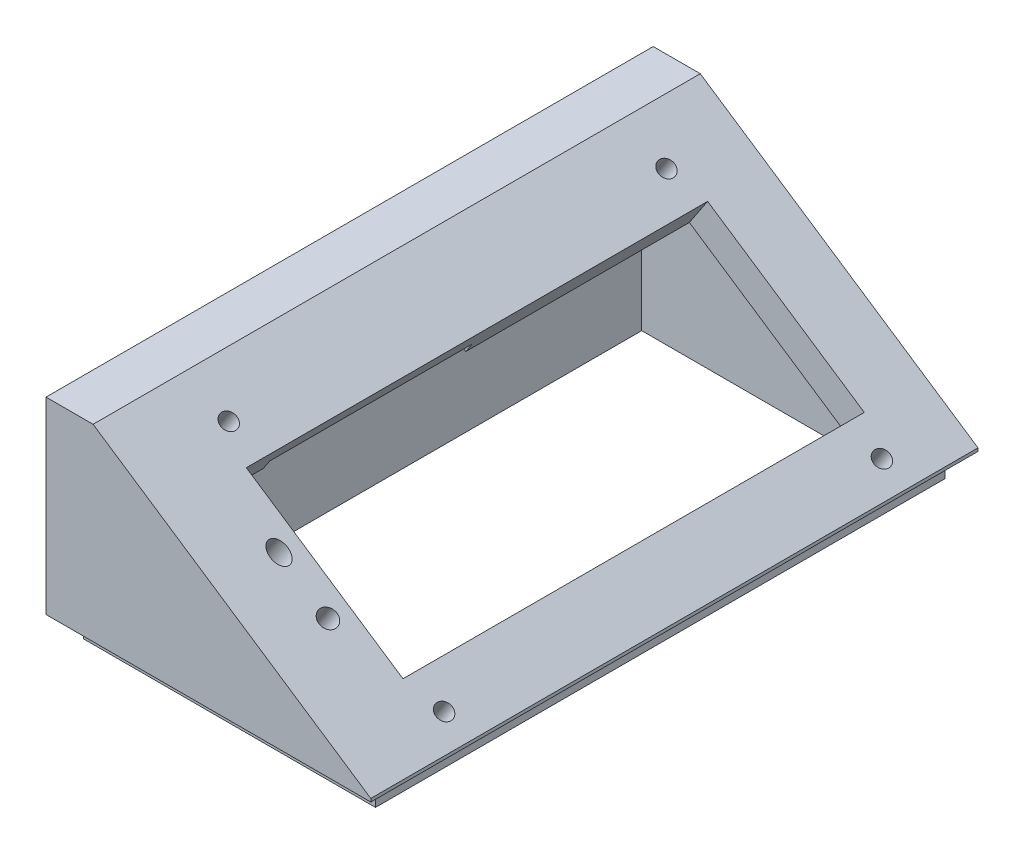
ISO-10303-21;
HEADER;
FILE_DESCRIPTION(('STEP AP214'),'2;1');
FILE_NAME('part.step','',(''),(''),'','','');
FILE_SCHEMA(('AUTOMOTIVE_DESIGN { 1 0 10303 214 1 1 1 1 }'));
ENDSEC;
DATA;
#1=APPLICATION_CONTEXT('core data for automotive mechanical design processes');
#2=APPLICATION_PROTOCOL_DEFINITION('international standard','automotive_design',2000,#1);
#3=PRODUCT_CONTEXT('',#1,'mechanical');
#4=PRODUCT('Part','Part','',(#3));
#5=PRODUCT_RELATED_PRODUCT_CATEGORY('part','',(#4));
#6=PRODUCT_DEFINITION_FORMATION('','',#4);
#7=PRODUCT_DEFINITION_CONTEXT('part definition',#1,'design');
#8=PRODUCT_DEFINITION('design','',#6,#7);
#9=PRODUCT_DEFINITION_SHAPE('','',#8);
#10=(LENGTH_UNIT() NAMED_UNIT(*) SI_UNIT(.MILLI.,.METRE.));
#11=(NAMED_UNIT(*) PLANE_ANGLE_UNIT() SI_UNIT($,.RADIAN.));
#12=(NAMED_UNIT(*) SI_UNIT($,.STERADIAN.) SOLID_ANGLE_UNIT());
#13=UNCERTAINTY_MEASURE_WITH_UNIT(LENGTH_MEASURE(1.E-05),#10,'distance_accuracy_value','');
#14=(GEOMETRIC_REPRESENTATION_CONTEXT(3) GLOBAL_UNCERTAINTY_ASSIGNED_CONTEXT((#13)) GLOBAL_UNIT_ASSIGNED_CONTEXT((#10,
#11,#12)) REPRESENTATION_CONTEXT('',''));
#15=CARTESIAN_POINT('',(0.,0.,0.));
#16=DIRECTION('',(0.,0.,1.));
#17=DIRECTION('',(1.,0.,0.));
#18=AXIS2_PLACEMENT_3D('',#15,#16,#17);
#19=CARTESIAN_POINT('',(0.,0.,64.5));
#20=DIRECTION('',(0.,1.,0.));
#21=DIRECTION('',(0.,0.,1.));
#22=AXIS2_PLACEMENT_3D('',#19,#20,#21);
#23=PLANE('',#22);
#24=DIRECTION('',(1.,0.,0.));
#25=VECTOR('',#24,1.);
#26=CARTESIAN_POINT('',(0.,0.,-64.5));
#27=LINE('',#26,#25);
#28=CARTESIAN_POINT('',(0.,0.,-64.5));
#29=VERTEX_POINT('',#28);
#30=CARTESIAN_POINT('',(69.,0.,-64.5));
#31=VERTEX_POINT('',#30);
#32=EDGE_CURVE('E239',#29,#31,#27,.T.);
#33=ORIENTED_EDGE('',*,*,#32,.T.);
#34=DIRECTION('',(0.,0.,1.));
#35=VECTOR('',#34,1.);
#36=CARTESIAN_POINT('',(69.,0.,64.5));
#37=LINE('',#36,#35);
#38=CARTESIAN_POINT('',(69.,0.,64.5));
#39=VERTEX_POINT('',#38);
#40=EDGE_CURVE('E51',#31,#39,#37,.T.);
#41=ORIENTED_EDGE('',*,*,#40,.T.);
#42=DIRECTION('',(1.,0.,0.));
#43=VECTOR('',#42,1.);
#44=CARTESIAN_POINT('',(0.,0.,64.5));
#45=LINE('',#44,#43);
#46=CARTESIAN_POINT('',(0.,0.,64.5));
#47=VERTEX_POINT('',#46);
#48=EDGE_CURVE('E222',#47,#39,#45,.T.);
#49=ORIENTED_EDGE('',*,*,#48,.F.);
#50=DIRECTION('',(0.,0.,-1.));
#51=VECTOR('',#50,1.);
#52=CARTESIAN_POINT('',(0.,0.,64.5));
#53=LINE('',#52,#51);
#54=EDGE_CURVE('E250',#47,#29,#53,.T.);
#55=ORIENTED_EDGE('',*,*,#54,.T.);
#56=EDGE_LOOP('',(#33,#41,#49,#55));
#57=FACE_BOUND('',#56,.T.);
#58=DIRECTION('',(0.,0.,-1.));
#59=VECTOR('',#58,1.);
#60=CARTESIAN_POINT('',(3.99999999999996,0.,60.5));
#61=LINE('',#60,#59);
#62=CARTESIAN_POINT('',(3.99999999999996,0.,60.5));
#63=VERTEX_POINT('',#62);
#64=CARTESIAN_POINT('',(3.99999999999996,0.,-60.5));
#65=VERTEX_POINT('',#64);
#66=EDGE_CURVE('E411',#63,#65,#61,.T.);
#67=ORIENTED_EDGE('',*,*,#66,.F.);
#68=DIRECTION('',(-1.,0.,0.));
#69=VECTOR('',#68,1.);
#70=CARTESIAN_POINT('',(3.99999999999996,0.,60.5));
#71=LINE('',#70,#69);
#72=CARTESIAN_POINT('',(66.,0.,60.5));
#73=VERTEX_POINT('',#72);
#74=EDGE_CURVE('E413',#73,#63,#71,.T.);
#75=ORIENTED_EDGE('',*,*,#74,.F.);
#76=DIRECTION('',(0.,0.,1.));
#77=VECTOR('',#76,1.);
#78=CARTESIAN_POINT('',(66.,0.,60.5));
#79=LINE('',#78,#77);
#80=CARTESIAN_POINT('',(66.,0.,-60.5));
#81=VERTEX_POINT('',#80);
#82=EDGE_CURVE('E430',#81,#73,#79,.T.);
#83=ORIENTED_EDGE('',*,*,#82,.F.);
#84=DIRECTION('',(1.,0.,0.));
#85=VECTOR('',#84,1.);
#86=CARTESIAN_POINT('',(3.99999999999996,0.,-60.5));
#87=LINE('',#86,#85);
#88=EDGE_CURVE('E416',#65,#81,#87,.T.);
#89=ORIENTED_EDGE('',*,*,#88,.F.);
#90=EDGE_LOOP('',(#67,#75,#83,#89));
#91=FACE_BOUND('',#90,.T.);
#92=ADVANCED_FACE('F37',(#57,#91),#23,.F.);
#93=CARTESIAN_POINT('',(0.,0.,64.5));
#94=DIRECTION('',(1.,0.,0.));
#95=DIRECTION('',(0.,0.,-1.));
#96=AXIS2_PLACEMENT_3D('',#93,#94,#95);
#97=PLANE('',#96);
#98=DIRECTION('',(0.,0.,1.));
#99=VECTOR('',#98,1.);
#100=CARTESIAN_POINT('',(0.,3.,35.5));
#101=LINE('',#100,#99);
#102=CARTESIAN_POINT('',(0.,3.,35.5));
#103=VERTEX_POINT('',#102);
#104=CARTESIAN_POINT('',(0.,3.,55.5));
#105=VERTEX_POINT('',#104);
#106=EDGE_CURVE('E479',#103,#105,#101,.T.);
#107=ORIENTED_EDGE('',*,*,#106,.F.);
#108=DIRECTION('',(0.,-1.,0.));
#109=VECTOR('',#108,1.);
#110=CARTESIAN_POINT('',(0.,3.,35.5));
#111=LINE('',#110,#109);
#112=CARTESIAN_POINT('',(0.,16.,35.5));
#113=VERTEX_POINT('',#112);
#114=EDGE_CURVE('E472',#113,#103,#111,.T.);
#115=ORIENTED_EDGE('',*,*,#114,.F.);
#116=DIRECTION('',(0.,0.,-1.));
#117=VECTOR('',#116,1.);
#118=CARTESIAN_POINT('',(0.,16.,35.5));
#119=LINE('',#118,#117);
#120=CARTESIAN_POINT('',(0.,16.,55.5));
#121=VERTEX_POINT('',#120);
#122=EDGE_CURVE('E291',#121,#113,#119,.T.);
#123=ORIENTED_EDGE('',*,*,#122,.F.);
#124=DIRECTION('',(0.,1.,0.));
#125=VECTOR('',#124,1.);
#126=CARTESIAN_POINT('',(0.,3.,55.5));
#127=LINE('',#126,#125);
#128=EDGE_CURVE('E279',#105,#121,#127,.T.);
#129=ORIENTED_EDGE('',*,*,#128,.F.);
#130=EDGE_LOOP('',(#107,#115,#123,#129));
#131=FACE_BOUND('',#130,.T.);
#132=DIRECTION('',(0.,-1.,0.));
#133=VECTOR('',#132,1.);
#134=CARTESIAN_POINT('',(0.,0.,-64.5));
#135=LINE('',#134,#133);
#136=CARTESIAN_POINT('',(0.,40.,-64.5));
#137=VERTEX_POINT('',#136);
#138=EDGE_CURVE('E236',#137,#29,#135,.T.);
#139=ORIENTED_EDGE('',*,*,#138,.T.);
#140=ORIENTED_EDGE('',*,*,#54,.F.);
#141=DIRECTION('',(0.,-1.,0.));
#142=VECTOR('',#141,1.);
#143=CARTESIAN_POINT('',(0.,0.,64.5));
#144=LINE('',#143,#142);
#145=CARTESIAN_POINT('',(0.,40.,64.5));
#146=VERTEX_POINT('',#145);
#147=EDGE_CURVE('E232',#146,#47,#144,.T.);
#148=ORIENTED_EDGE('',*,*,#147,.F.);
#149=DIRECTION('',(0.,0.,-1.));
#150=VECTOR('',#149,1.);
#151=CARTESIAN_POINT('',(0.,40.,64.5));
#152=LINE('',#151,#150);
#153=EDGE_CURVE('E230',#146,#137,#152,.T.);
#154=ORIENTED_EDGE('',*,*,#153,.T.);
#155=EDGE_LOOP('',(#139,#140,#148,#154));
#156=FACE_BOUND('',#155,.T.);
#157=ADVANCED_FACE('F39',(#131,#156),#97,.F.);
#158=CARTESIAN_POINT('',(10.,40.,64.5));
#159=DIRECTION('',(-0.554700196225229,-0.832050294337844,0.));
#160=DIRECTION('',(0.832050294337844,-0.554700196225229,0.));
#161=AXIS2_PLACEMENT_3D('',#158,#159,#160);
#162=PLANE('',#161);
#163=CARTESIAN_POINT('',(18.3205029433784,34.4529980377477,44.));
#164=DIRECTION('',(0.554700196225229,0.832050294337844,0.));
#165=DIRECTION('',(-0.832050294337844,0.554700196225229,0.));
#166=AXIS2_PLACEMENT_3D('',#163,#164,#165);
#167=CIRCLE('',#166,1.74999999999999);
#168=CARTESIAN_POINT('',(16.8644149282872,35.4237233811419,44.));
#169=VERTEX_POINT('',#168);
#170=EDGE_CURVE('E283',#169,#169,#167,.T.);
#171=ORIENTED_EDGE('',*,*,#170,.F.);
#172=EDGE_LOOP('',(#171));
#173=FACE_BOUND('',#172,.T.);
#174=CARTESIAN_POINT('',(18.3205029433785,34.4529980377477,-49.));
#175=DIRECTION('',(0.554700196225229,0.832050294337844,0.));
#176=DIRECTION('',(-0.832050294337844,0.554700196225229,0.));
#177=AXIS2_PLACEMENT_3D('',#174,#175,#176);
#178=CIRCLE('',#177,1.74999999999999);
#179=CARTESIAN_POINT('',(16.8644149282872,35.4237233811419,-49.));
#180=VERTEX_POINT('',#179);
#181=EDGE_CURVE('E297',#180,#180,#178,.T.);
#182=ORIENTED_EDGE('',*,*,#181,.F.);
#183=EDGE_LOOP('',(#182));
#184=FACE_BOUND('',#183,.T.);
#185=CARTESIAN_POINT('',(64.0832691319599,3.9444872453601,-49.));
#186=DIRECTION('',(0.554700196225229,0.832050294337844,0.));
#187=DIRECTION('',(-0.832050294337844,0.554700196225229,0.));
#188=AXIS2_PLACEMENT_3D('',#185,#186,#187);
#189=CIRCLE('',#188,1.74999999999999);
#190=CARTESIAN_POINT('',(62.6271811168687,4.91521258875424,-49.));
#191=VERTEX_POINT('',#190);
#192=EDGE_CURVE('E303',#191,#191,#189,.T.);
#193=ORIENTED_EDGE('',*,*,#192,.F.);
#194=EDGE_LOOP('',(#193));
#195=FACE_BOUND('',#194,.T.);
#196=CARTESIAN_POINT('',(64.0832691319599,3.94448724536011,44.));
#197=DIRECTION('',(0.554700196225229,0.832050294337844,0.));
#198=DIRECTION('',(-0.832050294337844,0.554700196225229,0.));
#199=AXIS2_PLACEMENT_3D('',#196,#197,#198);
#200=CIRCLE('',#199,1.74999999999999);
#201=CARTESIAN_POINT('',(62.6271811168686,4.91521258875425,44.));
#202=VERTEX_POINT('',#201);
#203=EDGE_CURVE('E309',#202,#202,#200,.T.);
#204=ORIENTED_EDGE('',*,*,#203,.F.);
#205=EDGE_LOOP('',(#204));
#206=FACE_BOUND('',#205,.T.);
#207=CARTESIAN_POINT('',(46.4022003772807,15.7318664151462,51.));
#208=DIRECTION('',(0.554700196225229,0.832050294337844,0.));
#209=DIRECTION('',(-0.832050294337844,0.554700196225229,0.));
#210=AXIS2_PLACEMENT_3D('',#207,#208,#209);
#211=CIRCLE('',#210,1.925);
#212=CARTESIAN_POINT('',(44.8005035606803,16.7996642928798,51.));
#213=VERTEX_POINT('',#212);
#214=EDGE_CURVE('E316',#213,#213,#211,.T.);
#215=ORIENTED_EDGE('',*,*,#214,.F.);
#216=EDGE_LOOP('',(#215));
#217=FACE_BOUND('',#216,.T.);
#218=CARTESIAN_POINT('',(36.0015716980576,22.6656188679616,51.));
#219=DIRECTION('',(0.554700196225229,0.832050294337844,0.));
#220=DIRECTION('',(-0.832050294337844,0.554700196225229,0.));
#221=AXIS2_PLACEMENT_3D('',#218,#219,#220);
#222=ELLIPSE('',#221,2.50000000000001,1.85);
#223=CARTESIAN_POINT('',(33.921445962213,24.0523693585247,51.));
#224=VERTEX_POINT('',#223);
#225=EDGE_CURVE('E315',#224,#224,#222,.T.);
#226=ORIENTED_EDGE('',*,*,#225,.F.);
#227=EDGE_LOOP('',(#226));
#228=FACE_BOUND('',#227,.T.);
#229=DIRECTION('',(0.832050294337844,-0.554700196225229,0.));
#230=VECTOR('',#229,1.);
#231=CARTESIAN_POINT('',(24.5608801509123,30.2927465660585,46.5));
#232=LINE('',#231,#230);
#233=CARTESIAN_POINT('',(24.5608801509123,30.2927465660585,46.5));
#234=VERTEX_POINT('',#233);
#235=CARTESIAN_POINT('',(57.842891924426,8.10473871704932,46.5));
#236=VERTEX_POINT('',#235);
#237=EDGE_CURVE('E540',#234,#236,#232,.T.);
#238=ORIENTED_EDGE('',*,*,#237,.F.);
#239=DIRECTION('',(0.,0.,1.));
#240=VECTOR('',#239,1.);
#241=CARTESIAN_POINT('',(24.5608801509123,30.2927465660585,46.5));
#242=LINE('',#241,#240);
#243=CARTESIAN_POINT('',(24.5608801509123,30.2927465660585,-51.5));
#244=VERTEX_POINT('',#243);
#245=EDGE_CURVE('E525',#244,#234,#242,.T.);
#246=ORIENTED_EDGE('',*,*,#245,.F.);
#247=DIRECTION('',(-0.832050294337844,0.554700196225229,0.));
#248=VECTOR('',#247,1.);
#249=CARTESIAN_POINT('',(24.5608801509123,30.2927465660585,-51.5));
#250=LINE('',#249,#248);
#251=CARTESIAN_POINT('',(57.842891924426,8.10473871704932,-51.5));
#252=VERTEX_POINT('',#251);
#253=EDGE_CURVE('E546',#252,#244,#250,.T.);
#254=ORIENTED_EDGE('',*,*,#253,.F.);
#255=DIRECTION('',(0.,0.,-1.));
#256=VECTOR('',#255,1.);
#257=CARTESIAN_POINT('',(57.842891924426,8.10473871704932,46.5));
#258=LINE('',#257,#256);
#259=EDGE_CURVE('E543',#236,#252,#258,.T.);
#260=ORIENTED_EDGE('',*,*,#259,.F.);
#261=EDGE_LOOP('',(#238,#246,#254,#260));
#262=FACE_BOUND('',#261,.T.);
#263=DIRECTION('',(-0.832050294337844,0.554700196225229,0.));
#264=VECTOR('',#263,1.);
#265=CARTESIAN_POINT('',(10.,40.,64.5));
#266=LINE('',#265,#264);
#267=CARTESIAN_POINT('',(69.,0.66666666666667,64.5));
#268=VERTEX_POINT('',#267);
#269=CARTESIAN_POINT('',(10.,40.,64.5));
#270=VERTEX_POINT('',#269);
#271=EDGE_CURVE('E219',#268,#270,#266,.T.);
#272=ORIENTED_EDGE('',*,*,#271,.F.);
#273=DIRECTION('',(0.,0.,-1.));
#274=VECTOR('',#273,1.);
#275=CARTESIAN_POINT('',(69.,0.666666666666663,64.5));
#276=LINE('',#275,#274);
#277=CARTESIAN_POINT('',(69.,0.66666666666667,-64.5));
#278=VERTEX_POINT('',#277);
#279=EDGE_CURVE('E208',#268,#278,#276,.T.);
#280=ORIENTED_EDGE('',*,*,#279,.T.);
#281=DIRECTION('',(-0.832050294337844,0.554700196225229,0.));
#282=VECTOR('',#281,1.);
#283=CARTESIAN_POINT('',(10.,40.,-64.5));
#284=LINE('',#283,#282);
#285=CARTESIAN_POINT('',(10.,40.,-64.5));
#286=VERTEX_POINT('',#285);
#287=EDGE_CURVE('E243',#278,#286,#284,.T.);
#288=ORIENTED_EDGE('',*,*,#287,.T.);
#289=DIRECTION('',(0.,0.,-1.));
#290=VECTOR('',#289,1.);
#291=CARTESIAN_POINT('',(10.,40.,64.5));
#292=LINE('',#291,#290);
#293=EDGE_CURVE('E226',#270,#286,#292,.T.);
#294=ORIENTED_EDGE('',*,*,#293,.F.);
#295=EDGE_LOOP('',(#272,#280,#288,#294));
#296=FACE_BOUND('',#295,.T.);
#297=ADVANCED_FACE('F224',(#173,#184,#195,#206,#217,#228,#262,#296),#162,.F.);
#298=CARTESIAN_POINT('',(0.,40.,64.5));
#299=DIRECTION('',(0.,-1.,0.));
#300=DIRECTION('',(0.,0.,-1.));
#301=AXIS2_PLACEMENT_3D('',#298,#299,#300);
#302=PLANE('',#301);
#303=DIRECTION('',(-1.,0.,0.));
#304=VECTOR('',#303,1.);
#305=CARTESIAN_POINT('',(0.,40.,-64.5));
#306=LINE('',#305,#304);
#307=EDGE_CURVE('E245',#286,#137,#306,.T.);
#308=ORIENTED_EDGE('',*,*,#307,.T.);
#309=ORIENTED_EDGE('',*,*,#153,.F.);
#310=DIRECTION('',(-1.,0.,0.));
#311=VECTOR('',#310,1.);
#312=CARTESIAN_POINT('',(0.,40.,64.5));
#313=LINE('',#312,#311);
#314=EDGE_CURVE('E228',#270,#146,#313,.T.);
#315=ORIENTED_EDGE('',*,*,#314,.F.);
#316=ORIENTED_EDGE('',*,*,#293,.T.);
#317=EDGE_LOOP('',(#308,#309,#315,#316));
#318=FACE_BOUND('',#317,.T.);
#319=ADVANCED_FACE('F394',(#318),#302,.F.);
#320=CARTESIAN_POINT('',(0.,0.,64.5));
#321=DIRECTION('',(0.,0.,-1.));
#322=DIRECTION('',(-1.,0.,0.));
#323=AXIS2_PLACEMENT_3D('',#320,#321,#322);
#324=PLANE('',#323);
#325=ORIENTED_EDGE('',*,*,#48,.T.);
#326=DIRECTION('',(0.,-1.,0.));
#327=VECTOR('',#326,1.);
#328=CARTESIAN_POINT('',(69.,-4.05126940790807,64.5));
#329=LINE('',#328,#327);
#330=EDGE_CURVE('E211',#268,#39,#329,.T.);
#331=ORIENTED_EDGE('',*,*,#330,.F.);
#332=ORIENTED_EDGE('',*,*,#271,.T.);
#333=ORIENTED_EDGE('',*,*,#314,.T.);
#334=ORIENTED_EDGE('',*,*,#147,.T.);
#335=EDGE_LOOP('',(#325,#331,#332,#333,#334));
#336=FACE_BOUND('',#335,.T.);
#337=ADVANCED_FACE('F218',(#336),#324,.F.);
#338=CARTESIAN_POINT('',(0.,0.,-64.5));
#339=DIRECTION('',(0.,0.,-1.));
#340=DIRECTION('',(-1.,0.,0.));
#341=AXIS2_PLACEMENT_3D('',#338,#339,#340);
#342=PLANE('',#341);
#343=DIRECTION('',(0.,1.,0.));
#344=VECTOR('',#343,1.);
#345=CARTESIAN_POINT('',(69.,0.,-64.5));
#346=LINE('',#345,#344);
#347=EDGE_CURVE('E11',#31,#278,#346,.T.);
#348=ORIENTED_EDGE('',*,*,#347,.F.);
#349=ORIENTED_EDGE('',*,*,#32,.F.);
#350=ORIENTED_EDGE('',*,*,#138,.F.);
#351=ORIENTED_EDGE('',*,*,#307,.F.);
#352=ORIENTED_EDGE('',*,*,#287,.F.);
#353=EDGE_LOOP('',(#348,#349,#350,#351,#352));
#354=FACE_BOUND('',#353,.T.);
#355=ADVANCED_FACE('F390',(#354),#342,.T.);
#356=CARTESIAN_POINT('',(3.99999999999996,-4.5,60.5));
#357=DIRECTION('',(1.,0.,0.));
#358=DIRECTION('',(0.,0.,-1.));
#359=AXIS2_PLACEMENT_3D('',#356,#357,#358);
#360=PLANE('',#359);
#361=ORIENTED_EDGE('',*,*,#66,.T.);
#362=DIRECTION('',(0.,1.,0.));
#363=VECTOR('',#362,1.);
#364=CARTESIAN_POINT('',(3.99999999999996,-4.5,-60.5));
#365=LINE('',#364,#363);
#366=CARTESIAN_POINT('',(3.99999999999996,-4.5,-60.5));
#367=VERTEX_POINT('',#366);
#368=EDGE_CURVE('E240',#367,#65,#365,.T.);
#369=ORIENTED_EDGE('',*,*,#368,.F.);
#370=DIRECTION('',(0.,0.,-1.));
#371=VECTOR('',#370,1.);
#372=CARTESIAN_POINT('',(3.99999999999996,-4.5,60.5));
#373=LINE('',#372,#371);
#374=CARTESIAN_POINT('',(3.99999999999996,-4.5,60.5));
#375=VERTEX_POINT('',#374);
#376=EDGE_CURVE('E429',#375,#367,#373,.T.);
#377=ORIENTED_EDGE('',*,*,#376,.F.);
#378=DIRECTION('',(0.,1.,0.));
#379=VECTOR('',#378,1.);
#380=CARTESIAN_POINT('',(3.99999999999996,-4.5,60.5));
#381=LINE('',#380,#379);
#382=EDGE_CURVE('E425',#375,#63,#381,.T.);
#383=ORIENTED_EDGE('',*,*,#382,.T.);
#384=EDGE_LOOP('',(#361,#369,#377,#383));
#385=FACE_BOUND('',#384,.T.);
#386=ADVANCED_FACE('F386',(#385),#360,.F.);
#387=CARTESIAN_POINT('',(3.99999999999996,-4.5,-60.5));
#388=DIRECTION('',(0.,0.,1.));
#389=DIRECTION('',(1.,0.,0.));
#390=AXIS2_PLACEMENT_3D('',#387,#388,#389);
#391=PLANE('',#390);
#392=ORIENTED_EDGE('',*,*,#88,.T.);
#393=DIRECTION('',(0.,1.,0.));
#394=VECTOR('',#393,1.);
#395=CARTESIAN_POINT('',(66.,-4.5,-60.5));
#396=LINE('',#395,#394);
#397=CARTESIAN_POINT('',(66.,-4.5,-60.5));
#398=VERTEX_POINT('',#397);
#399=EDGE_CURVE('E435',#398,#81,#396,.T.);
#400=ORIENTED_EDGE('',*,*,#399,.F.);
#401=DIRECTION('',(1.,0.,0.));
#402=VECTOR('',#401,1.);
#403=CARTESIAN_POINT('',(3.99999999999996,-4.5,-60.5));
#404=LINE('',#403,#402);
#405=EDGE_CURVE('E557',#367,#398,#404,.T.);
#406=ORIENTED_EDGE('',*,*,#405,.F.);
#407=ORIENTED_EDGE('',*,*,#368,.T.);
#408=EDGE_LOOP('',(#392,#400,#406,#407));
#409=FACE_BOUND('',#408,.T.);
#410=ADVANCED_FACE('F382',(#409),#391,.F.);
#411=CARTESIAN_POINT('',(66.,-4.5,60.5));
#412=DIRECTION('',(-1.,0.,0.));
#413=DIRECTION('',(0.,0.,1.));
#414=AXIS2_PLACEMENT_3D('',#411,#412,#413);
#415=PLANE('',#414);
#416=ORIENTED_EDGE('',*,*,#82,.T.);
#417=DIRECTION('',(0.,1.,0.));
#418=VECTOR('',#417,1.);
#419=CARTESIAN_POINT('',(66.,-4.5,60.5));
#420=LINE('',#419,#418);
#421=CARTESIAN_POINT('',(66.,-4.5,60.5));
#422=VERTEX_POINT('',#421);
#423=EDGE_CURVE('E428',#422,#73,#420,.T.);
#424=ORIENTED_EDGE('',*,*,#423,.F.);
#425=DIRECTION('',(0.,0.,1.));
#426=VECTOR('',#425,1.);
#427=CARTESIAN_POINT('',(66.,-4.5,60.5));
#428=LINE('',#427,#426);
#429=EDGE_CURVE('E437',#398,#422,#428,.T.);
#430=ORIENTED_EDGE('',*,*,#429,.F.);
#431=ORIENTED_EDGE('',*,*,#399,.T.);
#432=EDGE_LOOP('',(#416,#424,#430,#431));
#433=FACE_BOUND('',#432,.T.);
#434=ADVANCED_FACE('F378',(#433),#415,.F.);
#435=CARTESIAN_POINT('',(3.99999999999996,-4.5,60.5));
#436=DIRECTION('',(0.,0.,-1.));
#437=DIRECTION('',(-1.,0.,0.));
#438=AXIS2_PLACEMENT_3D('',#435,#436,#437);
#439=PLANE('',#438);
#440=ORIENTED_EDGE('',*,*,#74,.T.);
#441=ORIENTED_EDGE('',*,*,#382,.F.);
#442=DIRECTION('',(-1.,0.,0.));
#443=VECTOR('',#442,1.);
#444=CARTESIAN_POINT('',(3.99999999999996,-4.5,60.5));
#445=LINE('',#444,#443);
#446=EDGE_CURVE('E433',#422,#375,#445,.T.);
#447=ORIENTED_EDGE('',*,*,#446,.F.);
#448=ORIENTED_EDGE('',*,*,#423,.T.);
#449=EDGE_LOOP('',(#440,#441,#447,#448));
#450=FACE_BOUND('',#449,.T.);
#451=ADVANCED_FACE('F374',(#450),#439,.F.);
#452=CARTESIAN_POINT('',(0.,-4.5,0.));
#453=DIRECTION('',(0.,-1.,0.));
#454=DIRECTION('',(0.,0.,-1.));
#455=AXIS2_PLACEMENT_3D('',#452,#453,#454);
#456=PLANE('',#455);
#457=DIRECTION('',(1.,0.,0.));
#458=VECTOR('',#457,1.);
#459=CARTESIAN_POINT('',(6.55999999999997,-4.5,-55.5));
#460=LINE('',#459,#458);
#461=CARTESIAN_POINT('',(6.55854931321172,-4.5,-55.5));
#462=VERTEX_POINT('',#461);
#463=CARTESIAN_POINT('',(63.8000000000001,-4.5,-55.5));
#464=VERTEX_POINT('',#463);
#465=EDGE_CURVE('E507',#462,#464,#460,.T.);
#466=ORIENTED_EDGE('',*,*,#465,.F.);
#467=DIRECTION('',(0.,0.,1.));
#468=VECTOR('',#467,1.);
#469=CARTESIAN_POINT('',(6.55854931321172,-4.50000000000001,-124.401950120241));
#470=LINE('',#469,#468);
#471=CARTESIAN_POINT('',(6.55854931321172,-4.50000000000001,55.5));
#472=VERTEX_POINT('',#471);
#473=EDGE_CURVE('E505',#462,#472,#470,.T.);
#474=ORIENTED_EDGE('',*,*,#473,.T.);
#475=DIRECTION('',(-1.,0.,0.));
#476=VECTOR('',#475,1.);
#477=CARTESIAN_POINT('',(6.55999999999996,-4.5,55.5));
#478=LINE('',#477,#476);
#479=CARTESIAN_POINT('',(63.8,-4.5,55.5));
#480=VERTEX_POINT('',#479);
#481=EDGE_CURVE('E494',#480,#472,#478,.T.);
#482=ORIENTED_EDGE('',*,*,#481,.F.);
#483=DIRECTION('',(0.,0.,1.));
#484=VECTOR('',#483,1.);
#485=CARTESIAN_POINT('',(63.8,-4.5,55.5));
#486=LINE('',#485,#484);
#487=EDGE_CURVE('E519',#464,#480,#486,.T.);
#488=ORIENTED_EDGE('',*,*,#487,.F.);
#489=EDGE_LOOP('',(#466,#474,#482,#488));
#490=FACE_BOUND('',#489,.T.);
#491=ORIENTED_EDGE('',*,*,#376,.T.);
#492=ORIENTED_EDGE('',*,*,#405,.T.);
#493=ORIENTED_EDGE('',*,*,#429,.T.);
#494=ORIENTED_EDGE('',*,*,#446,.T.);
#495=EDGE_LOOP('',(#491,#492,#493,#494));
#496=FACE_BOUND('',#495,.T.);
#497=ADVANCED_FACE('F370',(#490,#496),#456,.T.);
#498=CARTESIAN_POINT('',(20.6779787773357,24.4683945056936,46.5));
#499=DIRECTION('',(-0.832050294337844,0.554700196225229,0.));
#500=DIRECTION('',(-0.554700196225229,-0.832050294337844,0.));
#501=AXIS2_PLACEMENT_3D('',#498,#499,#500);
#502=PLANE('',#501);
#503=DIRECTION('',(0.,0.,1.));
#504=VECTOR('',#503,1.);
#505=CARTESIAN_POINT('',(22.0647292678987,26.5485202415382,-4.));
#506=LINE('',#505,#504);
#507=CARTESIAN_POINT('',(22.0647292678987,26.5485202415382,-4.));
#508=VERTEX_POINT('',#507);
#509=CARTESIAN_POINT('',(22.0647292678987,26.5485202415382,39.));
#510=VERTEX_POINT('',#509);
#511=EDGE_CURVE('E453',#508,#510,#506,.T.);
#512=ORIENTED_EDGE('',*,*,#511,.F.);
#513=DIRECTION('',(-0.554700196225229,-0.832050294337843,0.));
#514=VECTOR('',#513,1.);
#515=CARTESIAN_POINT('',(22.0647292678987,26.5485202415382,-4.));
#516=LINE('',#515,#514);
#517=CARTESIAN_POINT('',(20.6779787773357,24.4683945056936,-4.));
#518=VERTEX_POINT('',#517);
#519=EDGE_CURVE('E469',#508,#518,#516,.T.);
#520=ORIENTED_EDGE('',*,*,#519,.T.);
#521=DIRECTION('',(0.,0.,1.));
#522=VECTOR('',#521,1.);
#523=CARTESIAN_POINT('',(20.6779787773357,24.4683945056936,46.5));
#524=LINE('',#523,#522);
#525=CARTESIAN_POINT('',(20.6779787773357,24.4683945056936,-51.5));
#526=VERTEX_POINT('',#525);
#527=EDGE_CURVE('E528',#526,#518,#524,.T.);
#528=ORIENTED_EDGE('',*,*,#527,.F.);
#529=DIRECTION('',(0.554700196225229,0.832050294337844,0.));
#530=VECTOR('',#529,1.);
#531=CARTESIAN_POINT('',(20.6779787773357,24.4683945056936,-51.5));
#532=LINE('',#531,#530);
#533=EDGE_CURVE('E420',#526,#244,#532,.T.);
#534=ORIENTED_EDGE('',*,*,#533,.T.);
#535=ORIENTED_EDGE('',*,*,#245,.T.);
#536=DIRECTION('',(0.554700196225229,0.832050294337844,0.));
#537=VECTOR('',#536,1.);
#538=CARTESIAN_POINT('',(20.6779787773357,24.4683945056936,46.5));
#539=LINE('',#538,#537);
#540=CARTESIAN_POINT('',(20.6779787773357,24.4683945056936,46.5));
#541=VERTEX_POINT('',#540);
#542=EDGE_CURVE('E538',#541,#234,#539,.T.);
#543=ORIENTED_EDGE('',*,*,#542,.F.);
#544=CARTESIAN_POINT('',(20.6779787773357,24.4683945056936,39.));
#545=VERTEX_POINT('',#544);
#546=EDGE_CURVE('E532',#545,#541,#524,.T.);
#547=ORIENTED_EDGE('',*,*,#546,.F.);
#548=DIRECTION('',(-0.554700196225229,-0.832050294337843,0.));
#549=VECTOR('',#548,1.);
#550=CARTESIAN_POINT('',(22.0647292678987,26.5485202415382,39.));
#551=LINE('',#550,#549);
#552=EDGE_CURVE('E59',#510,#545,#551,.T.);
#553=ORIENTED_EDGE('',*,*,#552,.F.);
#554=EDGE_LOOP('',(#512,#520,#528,#534,#535,#543,#547,#553));
#555=FACE_BOUND('',#554,.T.);
#556=ADVANCED_FACE('F360',(#555),#502,.F.);
#557=CARTESIAN_POINT('',(20.6779787773357,24.4683945056936,-51.5));
#558=DIRECTION('',(0.,0.,-1.));
#559=DIRECTION('',(-1.,0.,0.));
#560=AXIS2_PLACEMENT_3D('',#557,#558,#559);
#561=PLANE('',#560);
#562=ORIENTED_EDGE('',*,*,#253,.T.);
#563=ORIENTED_EDGE('',*,*,#533,.F.);
#564=DIRECTION('',(-0.832050294337844,0.554700196225229,0.));
#565=VECTOR('',#564,1.);
#566=CARTESIAN_POINT('',(20.6779787773357,24.4683945056936,-51.5));
#567=LINE('',#566,#565);
#568=CARTESIAN_POINT('',(53.9599905508494,2.28038665668441,-51.5));
#569=VERTEX_POINT('',#568);
#570=EDGE_CURVE('E536',#569,#526,#567,.T.);
#571=ORIENTED_EDGE('',*,*,#570,.F.);
#572=DIRECTION('',(0.554700196225229,0.832050294337844,0.));
#573=VECTOR('',#572,1.);
#574=CARTESIAN_POINT('',(53.9599905508494,2.28038665668441,-51.5));
#575=LINE('',#574,#573);
#576=EDGE_CURVE('E550',#569,#252,#575,.T.);
#577=ORIENTED_EDGE('',*,*,#576,.T.);
#578=EDGE_LOOP('',(#562,#563,#571,#577));
#579=FACE_BOUND('',#578,.T.);
#580=ADVANCED_FACE('F356',(#579),#561,.F.);
#581=CARTESIAN_POINT('',(53.9599905508494,2.28038665668441,46.5));
#582=DIRECTION('',(0.832050294337844,-0.554700196225229,0.));
#583=DIRECTION('',(0.554700196225229,0.832050294337844,0.));
#584=AXIS2_PLACEMENT_3D('',#581,#582,#583);
#585=PLANE('',#584);
#586=ORIENTED_EDGE('',*,*,#259,.T.);
#587=ORIENTED_EDGE('',*,*,#576,.F.);
#588=DIRECTION('',(0.,0.,-1.));
#589=VECTOR('',#588,1.);
#590=CARTESIAN_POINT('',(53.9599905508494,2.28038665668441,46.5));
#591=LINE('',#590,#589);
#592=CARTESIAN_POINT('',(53.9599905508494,2.28038665668441,46.5));
#593=VERTEX_POINT('',#592);
#594=EDGE_CURVE('E534',#593,#569,#591,.T.);
#595=ORIENTED_EDGE('',*,*,#594,.F.);
#596=DIRECTION('',(0.554700196225229,0.832050294337844,0.));
#597=VECTOR('',#596,1.);
#598=CARTESIAN_POINT('',(53.9599905508494,2.28038665668441,46.5));
#599=LINE('',#598,#597);
#600=EDGE_CURVE('E552',#593,#236,#599,.T.);
#601=ORIENTED_EDGE('',*,*,#600,.T.);
#602=EDGE_LOOP('',(#586,#587,#595,#601));
#603=FACE_BOUND('',#602,.T.);
#604=ADVANCED_FACE('F359',(#603),#585,.F.);
#605=CARTESIAN_POINT('',(20.6779787773357,24.4683945056936,46.5));
#606=DIRECTION('',(0.,0.,1.));
#607=DIRECTION('',(1.,0.,0.));
#608=AXIS2_PLACEMENT_3D('',#605,#606,#607);
#609=PLANE('',#608);
#610=ORIENTED_EDGE('',*,*,#237,.T.);
#611=ORIENTED_EDGE('',*,*,#600,.F.);
#612=DIRECTION('',(0.832050294337844,-0.554700196225229,0.));
#613=VECTOR('',#612,1.);
#614=CARTESIAN_POINT('',(20.6779787773357,24.4683945056936,46.5));
#615=LINE('',#614,#613);
#616=EDGE_CURVE('E531',#541,#593,#615,.T.);
#617=ORIENTED_EDGE('',*,*,#616,.F.);
#618=ORIENTED_EDGE('',*,*,#542,.T.);
#619=EDGE_LOOP('',(#610,#611,#617,#618));
#620=FACE_BOUND('',#619,.T.);
#621=ADVANCED_FACE('F349',(#620),#609,.F.);
#622=CARTESIAN_POINT('',(6.55999999999996,-3.27,55.5));
#623=DIRECTION('',(0.,0.,1.));
#624=DIRECTION('',(1.,0.,0.));
#625=AXIS2_PLACEMENT_3D('',#622,#623,#624);
#626=PLANE('',#625);
#627=DIRECTION('',(-1.,0.,0.));
#628=VECTOR('',#627,1.);
#629=CARTESIAN_POINT('',(10.,16.,55.5));
#630=LINE('',#629,#628);
#631=CARTESIAN_POINT('',(6.55854931321171,16.,55.5));
#632=VERTEX_POINT('',#631);
#633=EDGE_CURVE('E272',#632,#121,#630,.T.);
#634=ORIENTED_EDGE('',*,*,#633,.F.);
#635=DIRECTION('',(0.,-1.,0.));
#636=VECTOR('',#635,1.);
#637=CARTESIAN_POINT('',(6.55854931321171,33.8813474817762,55.5));
#638=LINE('',#637,#636);
#639=CARTESIAN_POINT('',(6.55854931321171,33.8813474817762,55.5));
#640=VERTEX_POINT('',#639);
#641=EDGE_CURVE('E266',#640,#632,#638,.T.);
#642=ORIENTED_EDGE('',*,*,#641,.F.);
#643=DIRECTION('',(-0.832050294337844,0.554700196225229,0.));
#644=VECTOR('',#643,1.);
#645=CARTESIAN_POINT('',(63.7804934942279,-4.26661530556789,55.5));
#646=LINE('',#645,#644);
#647=CARTESIAN_POINT('',(62.285570535876,-3.27,55.5));
#648=VERTEX_POINT('',#647);
#649=EDGE_CURVE('E323',#648,#640,#646,.T.);
#650=ORIENTED_EDGE('',*,*,#649,.F.);
#651=DIRECTION('',(-1.,0.,0.));
#652=VECTOR('',#651,1.);
#653=CARTESIAN_POINT('',(6.55999999999996,-3.27,55.5));
#654=LINE('',#653,#652);
#655=CARTESIAN_POINT('',(63.8,-3.27,55.5));
#656=VERTEX_POINT('',#655);
#657=EDGE_CURVE('E514',#656,#648,#654,.T.);
#658=ORIENTED_EDGE('',*,*,#657,.F.);
#659=DIRECTION('',(0.,-1.,0.));
#660=VECTOR('',#659,1.);
#661=CARTESIAN_POINT('',(63.8,-3.27,55.5));
#662=LINE('',#661,#660);
#663=EDGE_CURVE('E523',#656,#480,#662,.T.);
#664=ORIENTED_EDGE('',*,*,#663,.T.);
#665=ORIENTED_EDGE('',*,*,#481,.T.);
#666=CARTESIAN_POINT('',(6.55854931321172,3.,55.5));
#667=VERTEX_POINT('',#666);
#668=EDGE_CURVE('E491',#667,#472,#638,.T.);
#669=ORIENTED_EDGE('',*,*,#668,.F.);
#670=DIRECTION('',(-1.,0.,0.));
#671=VECTOR('',#670,1.);
#672=CARTESIAN_POINT('',(10.,3.,55.5));
#673=LINE('',#672,#671);
#674=EDGE_CURVE('E281',#667,#105,#673,.T.);
#675=ORIENTED_EDGE('',*,*,#674,.T.);
#676=ORIENTED_EDGE('',*,*,#128,.T.);
#677=EDGE_LOOP('',(#634,#642,#650,#658,#664,#665,#669,#675,#676));
#678=FACE_BOUND('',#677,.T.);
#679=ADVANCED_FACE('F276',(#678),#626,.F.);
#680=CARTESIAN_POINT('',(63.8,-3.27,55.5));
#681=DIRECTION('',(1.,0.,0.));
#682=DIRECTION('',(0.,0.,-1.));
#683=AXIS2_PLACEMENT_3D('',#680,#681,#682);
#684=PLANE('',#683);
#685=ORIENTED_EDGE('',*,*,#487,.T.);
#686=ORIENTED_EDGE('',*,*,#663,.F.);
#687=DIRECTION('',(0.,0.,1.));
#688=VECTOR('',#687,1.);
#689=CARTESIAN_POINT('',(63.8,-3.27,55.5));
#690=LINE('',#689,#688);
#691=CARTESIAN_POINT('',(63.8000000000001,-3.27,-55.5));
#692=VERTEX_POINT('',#691);
#693=EDGE_CURVE('E511',#692,#656,#690,.T.);
#694=ORIENTED_EDGE('',*,*,#693,.F.);
#695=DIRECTION('',(0.,-1.,0.));
#696=VECTOR('',#695,1.);
#697=CARTESIAN_POINT('',(63.8000000000001,-3.27,-55.5));
#698=LINE('',#697,#696);
#699=EDGE_CURVE('E517',#692,#464,#698,.T.);
#700=ORIENTED_EDGE('',*,*,#699,.T.);
#701=EDGE_LOOP('',(#685,#686,#694,#700));
#702=FACE_BOUND('',#701,.T.);
#703=ADVANCED_FACE('F348',(#702),#684,.F.);
#704=CARTESIAN_POINT('',(6.55999999999997,-3.27,-55.5));
#705=DIRECTION('',(0.,0.,-1.));
#706=DIRECTION('',(-1.,0.,0.));
#707=AXIS2_PLACEMENT_3D('',#704,#705,#706);
#708=PLANE('',#707);
#709=DIRECTION('',(0.,-1.,0.));
#710=VECTOR('',#709,1.);
#711=CARTESIAN_POINT('',(6.55854931321171,33.8813474817762,-55.5));
#712=LINE('',#711,#710);
#713=CARTESIAN_POINT('',(6.55854931321171,33.8813474817762,-55.5));
#714=VERTEX_POINT('',#713);
#715=EDGE_CURVE('E502',#714,#462,#712,.T.);
#716=ORIENTED_EDGE('',*,*,#715,.T.);
#717=ORIENTED_EDGE('',*,*,#465,.T.);
#718=ORIENTED_EDGE('',*,*,#699,.F.);
#719=DIRECTION('',(1.,0.,0.));
#720=VECTOR('',#719,1.);
#721=CARTESIAN_POINT('',(6.55999999999997,-3.27,-55.5));
#722=LINE('',#721,#720);
#723=CARTESIAN_POINT('',(62.285570535876,-3.27,-55.5));
#724=VERTEX_POINT('',#723);
#725=EDGE_CURVE('E509',#724,#692,#722,.T.);
#726=ORIENTED_EDGE('',*,*,#725,.F.);
#727=DIRECTION('',(-0.832050294337844,0.554700196225229,0.));
#728=VECTOR('',#727,1.);
#729=CARTESIAN_POINT('',(63.7804934942279,-4.26661530556789,-55.5));
#730=LINE('',#729,#728);
#731=EDGE_CURVE('E497',#724,#714,#730,.T.);
#732=ORIENTED_EDGE('',*,*,#731,.T.);
#733=EDGE_LOOP('',(#716,#717,#718,#726,#732));
#734=FACE_BOUND('',#733,.T.);
#735=ADVANCED_FACE('F344',(#734),#708,.F.);
#736=CARTESIAN_POINT('',(0.,-3.27,0.));
#737=DIRECTION('',(0.,-1.,0.));
#738=DIRECTION('',(0.,0.,-1.));
#739=AXIS2_PLACEMENT_3D('',#736,#737,#738);
#740=PLANE('',#739);
#741=DIRECTION('',(0.,0.,1.));
#742=VECTOR('',#741,1.);
#743=CARTESIAN_POINT('',(62.285570535876,-3.27,0.));
#744=LINE('',#743,#742);
#745=EDGE_CURVE('E253',#724,#648,#744,.T.);
#746=ORIENTED_EDGE('',*,*,#745,.F.);
#747=ORIENTED_EDGE('',*,*,#725,.T.);
#748=ORIENTED_EDGE('',*,*,#693,.T.);
#749=ORIENTED_EDGE('',*,*,#657,.T.);
#750=EDGE_LOOP('',(#746,#747,#748,#749));
#751=FACE_BOUND('',#750,.T.);
#752=ADVANCED_FACE('F340',(#751),#740,.T.);
#753=CARTESIAN_POINT('',(63.7804934942279,-4.26661530556789,-124.401950120241));
#754=DIRECTION('',(0.554700196225229,0.832050294337844,0.));
#755=DIRECTION('',(-0.832050294337844,0.554700196225229,0.));
#756=AXIS2_PLACEMENT_3D('',#753,#754,#755);
#757=PLANE('',#756);
#758=CARTESIAN_POINT('',(14.4376015698018,28.6286459773828,44.));
#759=DIRECTION('',(0.554700196225229,0.832050294337844,0.));
#760=DIRECTION('',(-0.832050294337844,0.554700196225229,0.));
#761=AXIS2_PLACEMENT_3D('',#758,#759,#760);
#762=CIRCLE('',#761,1.74999999999999);
#763=CARTESIAN_POINT('',(12.9815135547106,29.5993713207769,44.));
#764=VERTEX_POINT('',#763);
#765=EDGE_CURVE('E294',#764,#764,#762,.T.);
#766=ORIENTED_EDGE('',*,*,#765,.T.);
#767=EDGE_LOOP('',(#766));
#768=FACE_BOUND('',#767,.T.);
#769=CARTESIAN_POINT('',(14.4376015698019,28.6286459773828,-49.));
#770=DIRECTION('',(0.554700196225229,0.832050294337844,0.));
#771=DIRECTION('',(-0.832050294337844,0.554700196225229,0.));
#772=AXIS2_PLACEMENT_3D('',#769,#770,#771);
#773=CIRCLE('',#772,1.74999999999999);
#774=CARTESIAN_POINT('',(12.9815135547106,29.5993713207769,-49.));
#775=VERTEX_POINT('',#774);
#776=EDGE_CURVE('E300',#775,#775,#773,.T.);
#777=ORIENTED_EDGE('',*,*,#776,.T.);
#778=EDGE_LOOP('',(#777));
#779=FACE_BOUND('',#778,.T.);
#780=CARTESIAN_POINT('',(60.2003677583833,-1.87986481500482,-49.));
#781=DIRECTION('',(0.554700196225229,0.832050294337844,0.));
#782=DIRECTION('',(-0.832050294337844,0.554700196225229,0.));
#783=AXIS2_PLACEMENT_3D('',#780,#781,#782);
#784=CIRCLE('',#783,1.74999999999999);
#785=CARTESIAN_POINT('',(58.7442797432921,-0.909139471610675,-49.));
#786=VERTEX_POINT('',#785);
#787=EDGE_CURVE('E306',#786,#786,#784,.T.);
#788=ORIENTED_EDGE('',*,*,#787,.T.);
#789=EDGE_LOOP('',(#788));
#790=FACE_BOUND('',#789,.T.);
#791=CARTESIAN_POINT('',(60.2003677583833,-1.87986481500481,44.));
#792=DIRECTION('',(0.554700196225229,0.832050294337844,0.));
#793=DIRECTION('',(-0.832050294337844,0.554700196225229,0.));
#794=AXIS2_PLACEMENT_3D('',#791,#792,#793);
#795=CIRCLE('',#794,1.74999999999999);
#796=CARTESIAN_POINT('',(58.744279743292,-0.909139471610659,44.));
#797=VERTEX_POINT('',#796);
#798=EDGE_CURVE('E312',#797,#797,#795,.T.);
#799=ORIENTED_EDGE('',*,*,#798,.T.);
#800=EDGE_LOOP('',(#799));
#801=FACE_BOUND('',#800,.T.);
#802=CARTESIAN_POINT('',(42.5192990037041,9.90751435478131,51.));
#803=DIRECTION('',(0.554700196225229,0.832050294337844,0.));
#804=DIRECTION('',(-0.832050294337844,0.554700196225229,0.));
#805=AXIS2_PLACEMENT_3D('',#802,#803,#804);
#806=CIRCLE('',#805,1.925);
#807=CARTESIAN_POINT('',(40.9176021871037,10.9753122325149,51.));
#808=VERTEX_POINT('',#807);
#809=EDGE_CURVE('E319',#808,#808,#806,.F.);
#810=ORIENTED_EDGE('',*,*,#809,.F.);
#811=EDGE_LOOP('',(#810));
#812=FACE_BOUND('',#811,.T.);
#813=CARTESIAN_POINT('',(32.118670324481,16.8412668075967,51.));
#814=DIRECTION('',(0.554700196225229,0.832050294337844,0.));
#815=DIRECTION('',(-0.832050294337844,0.554700196225229,0.));
#816=AXIS2_PLACEMENT_3D('',#813,#814,#815);
#817=ELLIPSE('',#816,2.50000000000001,1.85);
#818=CARTESIAN_POINT('',(30.0385445886364,18.2280172981597,51.));
#819=VERTEX_POINT('',#818);
#820=EDGE_CURVE('E320',#819,#819,#817,.F.);
#821=ORIENTED_EDGE('',*,*,#820,.F.);
#822=EDGE_LOOP('',(#821));
#823=FACE_BOUND('',#822,.T.);
#824=ORIENTED_EDGE('',*,*,#745,.T.);
#825=ORIENTED_EDGE('',*,*,#649,.T.);
#826=DIRECTION('',(0.,0.,1.));
#827=VECTOR('',#826,1.);
#828=CARTESIAN_POINT('',(6.55854931321171,33.8813474817762,-124.401950120241));
#829=LINE('',#828,#827);
#830=EDGE_CURVE('E501',#714,#640,#829,.T.);
#831=ORIENTED_EDGE('',*,*,#830,.F.);
#832=ORIENTED_EDGE('',*,*,#731,.F.);
#833=EDGE_LOOP('',(#824,#825,#831,#832));
#834=FACE_BOUND('',#833,.T.);
#835=ORIENTED_EDGE('',*,*,#527,.T.);
#836=DIRECTION('',(0.832050294337844,-0.554700196225229,0.));
#837=VECTOR('',#836,1.);
#838=CARTESIAN_POINT('',(20.6779787773357,24.4683945056936,-4.));
#839=LINE('',#838,#837);
#840=CARTESIAN_POINT('',(11.5254255396194,30.5700966641711,-4.));
#841=VERTEX_POINT('',#840);
#842=EDGE_CURVE('E457',#841,#518,#839,.T.);
#843=ORIENTED_EDGE('',*,*,#842,.F.);
#844=DIRECTION('',(0.,0.,-1.));
#845=VECTOR('',#844,1.);
#846=CARTESIAN_POINT('',(11.5254255396194,30.5700966641711,-4.));
#847=LINE('',#846,#845);
#848=CARTESIAN_POINT('',(11.5254255396194,30.5700966641711,39.));
#849=VERTEX_POINT('',#848);
#850=EDGE_CURVE('E450',#849,#841,#847,.T.);
#851=ORIENTED_EDGE('',*,*,#850,.F.);
#852=DIRECTION('',(-0.832050294337844,0.554700196225229,0.));
#853=VECTOR('',#852,1.);
#854=CARTESIAN_POINT('',(20.6779787773357,24.4683945056936,39.));
#855=LINE('',#854,#853);
#856=EDGE_CURVE('E448',#545,#849,#855,.T.);
#857=ORIENTED_EDGE('',*,*,#856,.F.);
#858=ORIENTED_EDGE('',*,*,#546,.T.);
#859=ORIENTED_EDGE('',*,*,#616,.T.);
#860=ORIENTED_EDGE('',*,*,#594,.T.);
#861=ORIENTED_EDGE('',*,*,#570,.T.);
#862=EDGE_LOOP('',(#835,#843,#851,#857,#858,#859,#860,#861));
#863=FACE_BOUND('',#862,.T.);
#864=ADVANCED_FACE('F337',(#768,#779,#790,#801,#812,#823,#834,#863),#757,.F.);
#865=CARTESIAN_POINT('',(6.55854931321171,33.8813474817762,-124.401950120241));
#866=DIRECTION('',(-1.,0.,0.));
#867=DIRECTION('',(0.,-1.,0.));
#868=AXIS2_PLACEMENT_3D('',#865,#866,#867);
#869=PLANE('',#868);
#870=ORIENTED_EDGE('',*,*,#641,.T.);
#871=DIRECTION('',(0.,0.,-1.));
#872=VECTOR('',#871,1.);
#873=CARTESIAN_POINT('',(6.55854931321171,16.,-124.401950120241));
#874=LINE('',#873,#872);
#875=CARTESIAN_POINT('',(6.55854931321171,16.,35.5));
#876=VERTEX_POINT('',#875);
#877=EDGE_CURVE('E45',#632,#876,#874,.T.);
#878=ORIENTED_EDGE('',*,*,#877,.T.);
#879=DIRECTION('',(0.,-1.,0.));
#880=VECTOR('',#879,1.);
#881=CARTESIAN_POINT('',(6.55854931321171,33.8813474817762,35.5));
#882=LINE('',#881,#880);
#883=CARTESIAN_POINT('',(6.55854931321172,3.,35.5));
#884=VERTEX_POINT('',#883);
#885=EDGE_CURVE('E258',#876,#884,#882,.T.);
#886=ORIENTED_EDGE('',*,*,#885,.T.);
#887=DIRECTION('',(0.,0.,1.));
#888=VECTOR('',#887,1.);
#889=CARTESIAN_POINT('',(6.55854931321172,3.,-124.401950120241));
#890=LINE('',#889,#888);
#891=EDGE_CURVE('E255',#884,#667,#890,.T.);
#892=ORIENTED_EDGE('',*,*,#891,.T.);
#893=ORIENTED_EDGE('',*,*,#668,.T.);
#894=ORIENTED_EDGE('',*,*,#473,.F.);
#895=ORIENTED_EDGE('',*,*,#715,.F.);
#896=ORIENTED_EDGE('',*,*,#830,.T.);
#897=EDGE_LOOP('',(#870,#878,#886,#892,#893,#894,#895,#896));
#898=FACE_BOUND('',#897,.T.);
#899=ADVANCED_FACE('F263',(#898),#869,.F.);
#900=CARTESIAN_POINT('',(12.3854178519038,-12.7586119012692,51.));
#901=DIRECTION('',(0.554700196225229,0.832050294337844,0.));
#902=DIRECTION('',(-0.832050294337844,0.554700196225229,0.));
#903=AXIS2_PLACEMENT_3D('',#900,#901,#902);
#904=ELLIPSE('',#903,2.50000000000001,1.85);
#905=DIRECTION('',(0.554700196225229,0.832050294337844,0.));
#906=VECTOR('',#905,1.);
#907=SURFACE_OF_LINEAR_EXTRUSION('',#904,#906);
#908=ORIENTED_EDGE('',*,*,#225,.T.);
#909=EDGE_LOOP('',(#908));
#910=FACE_BOUND('',#909,.T.);
#911=ORIENTED_EDGE('',*,*,#820,.T.);
#912=EDGE_LOOP('',(#911));
#913=FACE_BOUND('',#912,.T.);
#914=ADVANCED_FACE('F328',(#910,#913),#907,.F.);
#915=CARTESIAN_POINT('',(22.7860465311268,-19.6923643540846,51.));
#916=DIRECTION('',(0.554700196225229,0.832050294337844,0.));
#917=DIRECTION('',(-0.832050294337844,0.554700196225229,0.));
#918=AXIS2_PLACEMENT_3D('',#915,#916,#917);
#919=CYLINDRICAL_SURFACE('',#918,1.925);
#920=ORIENTED_EDGE('',*,*,#214,.T.);
#921=EDGE_LOOP('',(#920));
#922=FACE_BOUND('',#921,.T.);
#923=ORIENTED_EDGE('',*,*,#809,.T.);
#924=EDGE_LOOP('',(#923));
#925=FACE_BOUND('',#924,.T.);
#926=ADVANCED_FACE('F332',(#922,#925),#919,.F.);
#927=CARTESIAN_POINT('',(64.0832691319599,3.94448724536011,44.));
#928=DIRECTION('',(0.554700196225229,0.832050294337844,0.));
#929=DIRECTION('',(-0.832050294337844,0.554700196225229,0.));
#930=AXIS2_PLACEMENT_3D('',#927,#928,#929);
#931=CYLINDRICAL_SURFACE('',#930,1.74999999999999);
#932=ORIENTED_EDGE('',*,*,#798,.F.);
#933=EDGE_LOOP('',(#932));
#934=FACE_BOUND('',#933,.T.);
#935=ORIENTED_EDGE('',*,*,#203,.T.);
#936=EDGE_LOOP('',(#935));
#937=FACE_BOUND('',#936,.T.);
#938=ADVANCED_FACE('F616',(#934,#937),#931,.F.);
#939=CARTESIAN_POINT('',(64.0832691319599,3.9444872453601,-49.));
#940=DIRECTION('',(0.554700196225229,0.832050294337844,0.));
#941=DIRECTION('',(-0.832050294337844,0.554700196225229,0.));
#942=AXIS2_PLACEMENT_3D('',#939,#940,#941);
#943=CYLINDRICAL_SURFACE('',#942,1.74999999999999);
#944=ORIENTED_EDGE('',*,*,#787,.F.);
#945=EDGE_LOOP('',(#944));
#946=FACE_BOUND('',#945,.T.);
#947=ORIENTED_EDGE('',*,*,#192,.T.);
#948=EDGE_LOOP('',(#947));
#949=FACE_BOUND('',#948,.T.);
#950=ADVANCED_FACE('F613',(#946,#949),#943,.F.);
#951=CARTESIAN_POINT('',(18.3205029433785,34.4529980377477,-49.));
#952=DIRECTION('',(0.554700196225229,0.832050294337844,0.));
#953=DIRECTION('',(-0.832050294337844,0.554700196225229,0.));
#954=AXIS2_PLACEMENT_3D('',#951,#952,#953);
#955=CYLINDRICAL_SURFACE('',#954,1.74999999999999);
#956=ORIENTED_EDGE('',*,*,#776,.F.);
#957=EDGE_LOOP('',(#956));
#958=FACE_BOUND('',#957,.T.);
#959=ORIENTED_EDGE('',*,*,#181,.T.);
#960=EDGE_LOOP('',(#959));
#961=FACE_BOUND('',#960,.T.);
#962=ADVANCED_FACE('F609',(#958,#961),#955,.F.);
#963=CARTESIAN_POINT('',(18.3205029433784,34.4529980377477,44.));
#964=DIRECTION('',(0.554700196225229,0.832050294337844,0.));
#965=DIRECTION('',(-0.832050294337844,0.554700196225229,0.));
#966=AXIS2_PLACEMENT_3D('',#963,#964,#965);
#967=CYLINDRICAL_SURFACE('',#966,1.74999999999999);
#968=ORIENTED_EDGE('',*,*,#765,.F.);
#969=EDGE_LOOP('',(#968));
#970=FACE_BOUND('',#969,.T.);
#971=ORIENTED_EDGE('',*,*,#170,.T.);
#972=EDGE_LOOP('',(#971));
#973=FACE_BOUND('',#972,.T.);
#974=ADVANCED_FACE('F606',(#970,#973),#967,.F.);
#975=CARTESIAN_POINT('',(10.,3.,35.5));
#976=DIRECTION('',(0.,0.,-1.));
#977=DIRECTION('',(-1.,0.,0.));
#978=AXIS2_PLACEMENT_3D('',#975,#976,#977);
#979=PLANE('',#978);
#980=DIRECTION('',(-1.,0.,0.));
#981=VECTOR('',#980,1.);
#982=CARTESIAN_POINT('',(10.,16.,35.5));
#983=LINE('',#982,#981);
#984=EDGE_CURVE('E274',#876,#113,#983,.T.);
#985=ORIENTED_EDGE('',*,*,#984,.T.);
#986=ORIENTED_EDGE('',*,*,#114,.T.);
#987=DIRECTION('',(-1.,0.,0.));
#988=VECTOR('',#987,1.);
#989=CARTESIAN_POINT('',(10.,3.,35.5));
#990=LINE('',#989,#988);
#991=EDGE_CURVE('E285',#884,#103,#990,.T.);
#992=ORIENTED_EDGE('',*,*,#991,.F.);
#993=ORIENTED_EDGE('',*,*,#885,.F.);
#994=EDGE_LOOP('',(#985,#986,#992,#993));
#995=FACE_BOUND('',#994,.T.);
#996=ADVANCED_FACE('F486',(#995),#979,.F.);
#997=CARTESIAN_POINT('',(10.,16.,35.5));
#998=DIRECTION('',(0.,1.,0.));
#999=DIRECTION('',(0.,0.,1.));
#1000=AXIS2_PLACEMENT_3D('',#997,#998,#999);
#1001=PLANE('',#1000);
#1002=ORIENTED_EDGE('',*,*,#633,.T.);
#1003=ORIENTED_EDGE('',*,*,#122,.T.);
#1004=ORIENTED_EDGE('',*,*,#984,.F.);
#1005=ORIENTED_EDGE('',*,*,#877,.F.);
#1006=EDGE_LOOP('',(#1002,#1003,#1004,#1005));
#1007=FACE_BOUND('',#1006,.T.);
#1008=ADVANCED_FACE('F270',(#1007),#1001,.F.);
#1009=CARTESIAN_POINT('',(10.,3.,35.5));
#1010=DIRECTION('',(0.,-1.,0.));
#1011=DIRECTION('',(0.,0.,-1.));
#1012=AXIS2_PLACEMENT_3D('',#1009,#1010,#1011);
#1013=PLANE('',#1012);
#1014=ORIENTED_EDGE('',*,*,#991,.T.);
#1015=ORIENTED_EDGE('',*,*,#106,.T.);
#1016=ORIENTED_EDGE('',*,*,#674,.F.);
#1017=ORIENTED_EDGE('',*,*,#891,.F.);
#1018=EDGE_LOOP('',(#1014,#1015,#1016,#1017));
#1019=FACE_BOUND('',#1018,.T.);
#1020=ADVANCED_FACE('F488',(#1019),#1013,.F.);
#1021=CARTESIAN_POINT('',(22.0647292678987,26.5485202415382,-4.));
#1022=DIRECTION('',(0.,0.,-1.));
#1023=DIRECTION('',(-1.,0.,0.));
#1024=AXIS2_PLACEMENT_3D('',#1021,#1022,#1023);
#1025=PLANE('',#1024);
#1026=ORIENTED_EDGE('',*,*,#842,.T.);
#1027=ORIENTED_EDGE('',*,*,#519,.F.);
#1028=DIRECTION('',(0.832050294337844,-0.554700196225229,0.));
#1029=VECTOR('',#1028,1.);
#1030=CARTESIAN_POINT('',(22.0647292678987,26.5485202415382,-4.));
#1031=LINE('',#1030,#1029);
#1032=CARTESIAN_POINT('',(12.9121760301825,32.6502224000157,-4.));
#1033=VERTEX_POINT('',#1032);
#1034=EDGE_CURVE('E463',#1033,#508,#1031,.T.);
#1035=ORIENTED_EDGE('',*,*,#1034,.F.);
#1036=DIRECTION('',(-0.554700196225229,-0.832050294337843,0.));
#1037=VECTOR('',#1036,1.);
#1038=CARTESIAN_POINT('',(12.9121760301825,32.6502224000157,-4.));
#1039=LINE('',#1038,#1037);
#1040=EDGE_CURVE('E473',#1033,#841,#1039,.T.);
#1041=ORIENTED_EDGE('',*,*,#1040,.T.);
#1042=EDGE_LOOP('',(#1026,#1027,#1035,#1041));
#1043=FACE_BOUND('',#1042,.T.);
#1044=ADVANCED_FACE('F585',(#1043),#1025,.F.);
#1045=CARTESIAN_POINT('',(12.9121760301825,32.6502224000157,-4.));
#1046=DIRECTION('',(-0.832050294337843,0.554700196225229,0.));
#1047=DIRECTION('',(-0.554700196225229,-0.832050294337844,0.));
#1048=AXIS2_PLACEMENT_3D('',#1045,#1046,#1047);
#1049=PLANE('',#1048);
#1050=ORIENTED_EDGE('',*,*,#850,.T.);
#1051=ORIENTED_EDGE('',*,*,#1040,.F.);
#1052=DIRECTION('',(0.,0.,-1.));
#1053=VECTOR('',#1052,1.);
#1054=CARTESIAN_POINT('',(12.9121760301825,32.6502224000157,-4.));
#1055=LINE('',#1054,#1053);
#1056=CARTESIAN_POINT('',(12.9121760301825,32.6502224000157,39.));
#1057=VERTEX_POINT('',#1056);
#1058=EDGE_CURVE('E460',#1057,#1033,#1055,.T.);
#1059=ORIENTED_EDGE('',*,*,#1058,.F.);
#1060=DIRECTION('',(-0.554700196225229,-0.832050294337843,0.));
#1061=VECTOR('',#1060,1.);
#1062=CARTESIAN_POINT('',(12.9121760301825,32.6502224000157,39.));
#1063=LINE('',#1062,#1061);
#1064=EDGE_CURVE('E475',#1057,#849,#1063,.T.);
#1065=ORIENTED_EDGE('',*,*,#1064,.T.);
#1066=EDGE_LOOP('',(#1050,#1051,#1059,#1065));
#1067=FACE_BOUND('',#1066,.T.);
#1068=ADVANCED_FACE('F588',(#1067),#1049,.F.);
#1069=CARTESIAN_POINT('',(22.0647292678987,26.5485202415382,39.));
#1070=DIRECTION('',(0.,0.,1.));
#1071=DIRECTION('',(1.,0.,0.));
#1072=AXIS2_PLACEMENT_3D('',#1069,#1070,#1071);
#1073=PLANE('',#1072);
#1074=ORIENTED_EDGE('',*,*,#856,.T.);
#1075=ORIENTED_EDGE('',*,*,#1064,.F.);
#1076=DIRECTION('',(-0.832050294337844,0.554700196225229,0.));
#1077=VECTOR('',#1076,1.);
#1078=CARTESIAN_POINT('',(22.0647292678987,26.5485202415382,39.));
#1079=LINE('',#1078,#1077);
#1080=EDGE_CURVE('E456',#510,#1057,#1079,.T.);
#1081=ORIENTED_EDGE('',*,*,#1080,.F.);
#1082=ORIENTED_EDGE('',*,*,#552,.T.);
#1083=EDGE_LOOP('',(#1074,#1075,#1081,#1082));
#1084=FACE_BOUND('',#1083,.T.);
#1085=ADVANCED_FACE('F589',(#1084),#1073,.F.);
#1086=CARTESIAN_POINT('',(19.042310655448,28.563465983172,0.));
#1087=DIRECTION('',(-0.554700196225229,-0.832050294337844,0.));
#1088=DIRECTION('',(0.832050294337844,-0.554700196225229,0.));
#1089=AXIS2_PLACEMENT_3D('',#1086,#1087,#1088);
#1090=PLANE('',#1089);
#1091=ORIENTED_EDGE('',*,*,#511,.T.);
#1092=ORIENTED_EDGE('',*,*,#1080,.T.);
#1093=ORIENTED_EDGE('',*,*,#1058,.T.);
#1094=ORIENTED_EDGE('',*,*,#1034,.T.);
#1095=EDGE_LOOP('',(#1091,#1092,#1093,#1094));
#1096=FACE_BOUND('',#1095,.T.);
#1097=ADVANCED_FACE('F581',(#1096),#1090,.T.);
#1098=CARTESIAN_POINT('',(69.,-4.05126940790807,-64.5));
#1099=DIRECTION('',(-1.,0.,0.));
#1100=DIRECTION('',(0.,0.,1.));
#1101=AXIS2_PLACEMENT_3D('',#1098,#1099,#1100);
#1102=PLANE('',#1101);
#1103=ORIENTED_EDGE('',*,*,#347,.T.);
#1104=ORIENTED_EDGE('',*,*,#279,.F.);
#1105=ORIENTED_EDGE('',*,*,#330,.T.);
#1106=ORIENTED_EDGE('',*,*,#40,.F.);
#1107=EDGE_LOOP('',(#1103,#1104,#1105,#1106));
#1108=FACE_BOUND('',#1107,.T.);
#1109=ADVANCED_FACE('F210',(#1108),#1102,.F.);
#1110=CLOSED_SHELL('',(#92,#157,#297,#319,#337,#355,#386,#410,#434,#451,#497,#556,#580,#604,
#621,#679,#703,#735,#752,#864,#899,#914,#926,#938,#950,#962,#974,#996,#1008,#1020,#1044,#1068,
#1085,#1097,#1109));
#1111=MANIFOLD_SOLID_BREP('B2',#1110);
#1112=ADVANCED_BREP_SHAPE_REPRESENTATION('',(#18,#1111),#14);
#1113=SHAPE_DEFINITION_REPRESENTATION(#9,#1112);
ENDSEC;
END-ISO-10303-21;
